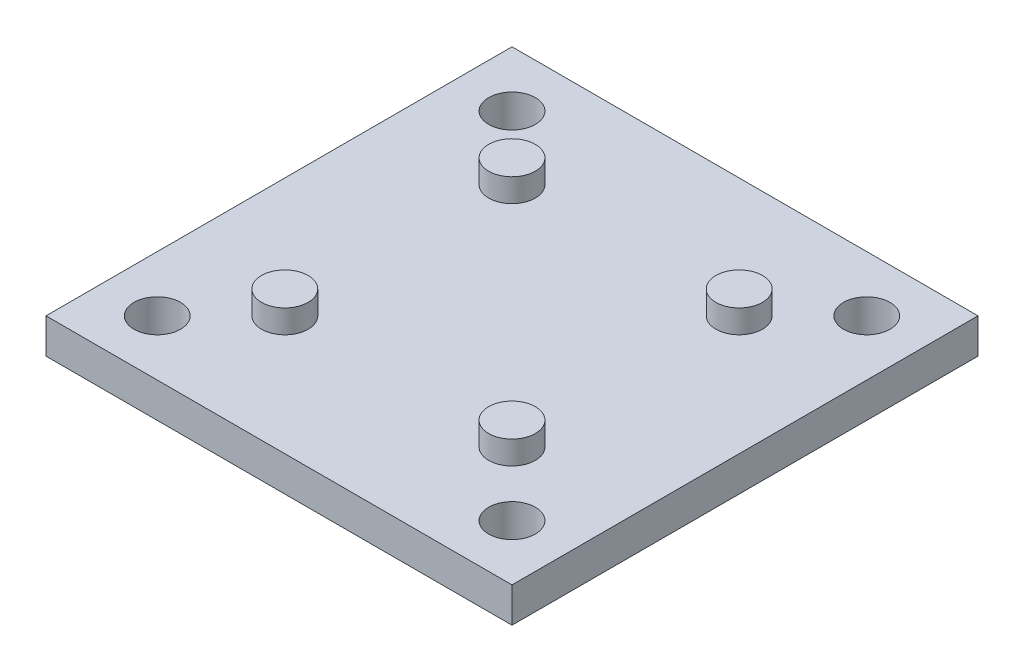
ISO-10303-21;
HEADER;
FILE_DESCRIPTION(('STEP AP214'),'2;1');
FILE_NAME('part.step','',(''),(''),'','','');
FILE_SCHEMA(('AUTOMOTIVE_DESIGN { 1 0 10303 214 1 1 1 1 }'));
ENDSEC;
DATA;
#1=APPLICATION_CONTEXT('core data for automotive mechanical design processes');
#2=APPLICATION_PROTOCOL_DEFINITION('international standard','automotive_design',2000,#1);
#3=PRODUCT_CONTEXT('',#1,'mechanical');
#4=PRODUCT('Part','Part','',(#3));
#5=PRODUCT_RELATED_PRODUCT_CATEGORY('part','',(#4));
#6=PRODUCT_DEFINITION_FORMATION('','',#4);
#7=PRODUCT_DEFINITION_CONTEXT('part definition',#1,'design');
#8=PRODUCT_DEFINITION('design','',#6,#7);
#9=PRODUCT_DEFINITION_SHAPE('','',#8);
#10=(LENGTH_UNIT() NAMED_UNIT(*) SI_UNIT(.MILLI.,.METRE.));
#11=(NAMED_UNIT(*) PLANE_ANGLE_UNIT() SI_UNIT($,.RADIAN.));
#12=(NAMED_UNIT(*) SI_UNIT($,.STERADIAN.) SOLID_ANGLE_UNIT());
#13=UNCERTAINTY_MEASURE_WITH_UNIT(LENGTH_MEASURE(1.E-05),#10,'distance_accuracy_value','');
#14=(GEOMETRIC_REPRESENTATION_CONTEXT(3) GLOBAL_UNCERTAINTY_ASSIGNED_CONTEXT((#13)) GLOBAL_UNIT_ASSIGNED_CONTEXT((#10,
#11,#12)) REPRESENTATION_CONTEXT('',''));
#15=CARTESIAN_POINT('',(0.,0.,0.));
#16=DIRECTION('',(0.,0.,1.));
#17=DIRECTION('',(1.,0.,0.));
#18=AXIS2_PLACEMENT_3D('',#15,#16,#17);
#19=CARTESIAN_POINT('',(-20.,3.,20.));
#20=DIRECTION('',(0.,0.,-1.));
#21=DIRECTION('',(-1.,0.,0.));
#22=AXIS2_PLACEMENT_3D('',#19,#20,#21);
#23=PLANE('',#22);
#24=DIRECTION('',(1.,0.,0.));
#25=VECTOR('',#24,1.);
#26=CARTESIAN_POINT('',(-20.,0.,20.));
#27=LINE('',#26,#25);
#28=CARTESIAN_POINT('',(-20.,0.,20.));
#29=VERTEX_POINT('',#28);
#30=CARTESIAN_POINT('',(20.,0.,20.));
#31=VERTEX_POINT('',#30);
#32=EDGE_CURVE('E107',#29,#31,#27,.T.);
#33=ORIENTED_EDGE('',*,*,#32,.T.);
#34=DIRECTION('',(0.,-1.,0.));
#35=VECTOR('',#34,1.);
#36=CARTESIAN_POINT('',(20.,3.,20.));
#37=LINE('',#36,#35);
#38=CARTESIAN_POINT('',(20.,3.,20.));
#39=VERTEX_POINT('',#38);
#40=EDGE_CURVE('E11',#39,#31,#37,.T.);
#41=ORIENTED_EDGE('',*,*,#40,.F.);
#42=DIRECTION('',(1.,0.,0.));
#43=VECTOR('',#42,1.);
#44=CARTESIAN_POINT('',(-20.,3.,20.));
#45=LINE('',#44,#43);
#46=CARTESIAN_POINT('',(-20.,3.,20.));
#47=VERTEX_POINT('',#46);
#48=EDGE_CURVE('E89',#47,#39,#45,.T.);
#49=ORIENTED_EDGE('',*,*,#48,.F.);
#50=DIRECTION('',(0.,-1.,0.));
#51=VECTOR('',#50,1.);
#52=CARTESIAN_POINT('',(-20.,3.,20.));
#53=LINE('',#52,#51);
#54=EDGE_CURVE('E56',#47,#29,#53,.T.);
#55=ORIENTED_EDGE('',*,*,#54,.T.);
#56=EDGE_LOOP('',(#33,#41,#49,#55));
#57=FACE_BOUND('',#56,.T.);
#58=ADVANCED_FACE('F39',(#57),#23,.F.);
#59=CARTESIAN_POINT('',(20.,3.,20.));
#60=DIRECTION('',(-1.,0.,0.));
#61=DIRECTION('',(0.,0.,1.));
#62=AXIS2_PLACEMENT_3D('',#59,#60,#61);
#63=PLANE('',#62);
#64=DIRECTION('',(0.,0.,-1.));
#65=VECTOR('',#64,1.);
#66=CARTESIAN_POINT('',(20.,0.,20.));
#67=LINE('',#66,#65);
#68=CARTESIAN_POINT('',(20.,0.,-20.));
#69=VERTEX_POINT('',#68);
#70=EDGE_CURVE('E95',#31,#69,#67,.T.);
#71=ORIENTED_EDGE('',*,*,#70,.T.);
#72=DIRECTION('',(0.,-1.,0.));
#73=VECTOR('',#72,1.);
#74=CARTESIAN_POINT('',(20.,3.,-20.));
#75=LINE('',#74,#73);
#76=CARTESIAN_POINT('',(20.,3.,-20.));
#77=VERTEX_POINT('',#76);
#78=EDGE_CURVE('E48',#77,#69,#75,.T.);
#79=ORIENTED_EDGE('',*,*,#78,.F.);
#80=DIRECTION('',(0.,0.,-1.));
#81=VECTOR('',#80,1.);
#82=CARTESIAN_POINT('',(20.,3.,20.));
#83=LINE('',#82,#81);
#84=EDGE_CURVE('E81',#39,#77,#83,.T.);
#85=ORIENTED_EDGE('',*,*,#84,.F.);
#86=ORIENTED_EDGE('',*,*,#40,.T.);
#87=EDGE_LOOP('',(#71,#79,#85,#86));
#88=FACE_BOUND('',#87,.T.);
#89=ADVANCED_FACE('F94',(#88),#63,.F.);
#90=CARTESIAN_POINT('',(-20.,3.,-20.));
#91=DIRECTION('',(0.,0.,-1.));
#92=DIRECTION('',(-1.,0.,0.));
#93=AXIS2_PLACEMENT_3D('',#90,#91,#92);
#94=PLANE('',#93);
#95=DIRECTION('',(1.,0.,0.));
#96=VECTOR('',#95,1.);
#97=CARTESIAN_POINT('',(-20.,0.,-20.));
#98=LINE('',#97,#96);
#99=CARTESIAN_POINT('',(-20.,0.,-20.));
#100=VERTEX_POINT('',#99);
#101=EDGE_CURVE('E113',#100,#69,#98,.T.);
#102=ORIENTED_EDGE('',*,*,#101,.F.);
#103=DIRECTION('',(0.,-1.,0.));
#104=VECTOR('',#103,1.);
#105=CARTESIAN_POINT('',(-20.,3.,-20.));
#106=LINE('',#105,#104);
#107=CARTESIAN_POINT('',(-20.,3.,-20.));
#108=VERTEX_POINT('',#107);
#109=EDGE_CURVE('E70',#108,#100,#106,.T.);
#110=ORIENTED_EDGE('',*,*,#109,.F.);
#111=DIRECTION('',(1.,0.,0.));
#112=VECTOR('',#111,1.);
#113=CARTESIAN_POINT('',(-20.,3.,-20.));
#114=LINE('',#113,#112);
#115=EDGE_CURVE('E88',#108,#77,#114,.T.);
#116=ORIENTED_EDGE('',*,*,#115,.T.);
#117=ORIENTED_EDGE('',*,*,#78,.T.);
#118=EDGE_LOOP('',(#102,#110,#116,#117));
#119=FACE_BOUND('',#118,.T.);
#120=ADVANCED_FACE('F99',(#119),#94,.T.);
#121=CARTESIAN_POINT('',(-20.,3.,20.));
#122=DIRECTION('',(-1.,0.,0.));
#123=DIRECTION('',(0.,0.,1.));
#124=AXIS2_PLACEMENT_3D('',#121,#122,#123);
#125=PLANE('',#124);
#126=DIRECTION('',(0.,0.,-1.));
#127=VECTOR('',#126,1.);
#128=CARTESIAN_POINT('',(-20.,0.,20.));
#129=LINE('',#128,#127);
#130=EDGE_CURVE('E116',#29,#100,#129,.T.);
#131=ORIENTED_EDGE('',*,*,#130,.F.);
#132=ORIENTED_EDGE('',*,*,#54,.F.);
#133=DIRECTION('',(0.,0.,-1.));
#134=VECTOR('',#133,1.);
#135=CARTESIAN_POINT('',(-20.,3.,20.));
#136=LINE('',#135,#134);
#137=EDGE_CURVE('E101',#47,#108,#136,.T.);
#138=ORIENTED_EDGE('',*,*,#137,.T.);
#139=ORIENTED_EDGE('',*,*,#109,.T.);
#140=EDGE_LOOP('',(#131,#132,#138,#139));
#141=FACE_BOUND('',#140,.T.);
#142=ADVANCED_FACE('F211',(#141),#125,.T.);
#143=CARTESIAN_POINT('',(0.,3.,0.));
#144=DIRECTION('',(0.,1.,0.));
#145=DIRECTION('',(0.,0.,1.));
#146=AXIS2_PLACEMENT_3D('',#143,#144,#145);
#147=PLANE('',#146);
#148=CARTESIAN_POINT('',(9.75,3.,9.75));
#149=DIRECTION('',(0.,1.,0.));
#150=DIRECTION('',(0.,0.,1.));
#151=AXIS2_PLACEMENT_3D('',#148,#149,#150);
#152=CIRCLE('',#151,2.);
#153=CARTESIAN_POINT('',(9.75,3.,11.75));
#154=VERTEX_POINT('',#153);
#155=EDGE_CURVE('E181',#154,#154,#152,.F.);
#156=ORIENTED_EDGE('',*,*,#155,.T.);
#157=EDGE_LOOP('',(#156));
#158=FACE_BOUND('',#157,.T.);
#159=CARTESIAN_POINT('',(-9.75,3.,9.75));
#160=DIRECTION('',(0.,1.,0.));
#161=DIRECTION('',(0.,0.,1.));
#162=AXIS2_PLACEMENT_3D('',#159,#160,#161);
#163=CIRCLE('',#162,2.);
#164=CARTESIAN_POINT('',(-9.75,3.,11.75));
#165=VERTEX_POINT('',#164);
#166=EDGE_CURVE('E173',#165,#165,#163,.F.);
#167=ORIENTED_EDGE('',*,*,#166,.T.);
#168=EDGE_LOOP('',(#167));
#169=FACE_BOUND('',#168,.T.);
#170=CARTESIAN_POINT('',(9.75,3.,-9.75));
#171=DIRECTION('',(0.,1.,0.));
#172=DIRECTION('',(0.,0.,1.));
#173=AXIS2_PLACEMENT_3D('',#170,#171,#172);
#174=CIRCLE('',#173,2.);
#175=CARTESIAN_POINT('',(9.75,3.,-7.75));
#176=VERTEX_POINT('',#175);
#177=EDGE_CURVE('E165',#176,#176,#174,.F.);
#178=ORIENTED_EDGE('',*,*,#177,.T.);
#179=EDGE_LOOP('',(#178));
#180=FACE_BOUND('',#179,.T.);
#181=CARTESIAN_POINT('',(-9.75,3.,-9.75));
#182=DIRECTION('',(0.,1.,0.));
#183=DIRECTION('',(0.,0.,1.));
#184=AXIS2_PLACEMENT_3D('',#181,#182,#183);
#185=CIRCLE('',#184,2.);
#186=CARTESIAN_POINT('',(-9.75,3.,-7.75));
#187=VERTEX_POINT('',#186);
#188=EDGE_CURVE('E139',#187,#187,#185,.F.);
#189=ORIENTED_EDGE('',*,*,#188,.T.);
#190=EDGE_LOOP('',(#189));
#191=FACE_BOUND('',#190,.T.);
#192=CARTESIAN_POINT('',(-15.2247989874837,3.,-15.2247989874837));
#193=DIRECTION('',(0.,1.,0.));
#194=DIRECTION('',(0.,0.,1.));
#195=AXIS2_PLACEMENT_3D('',#192,#193,#194);
#196=CIRCLE('',#195,2.);
#197=CARTESIAN_POINT('',(-15.2247989874837,3.,-13.2247989874837));
#198=VERTEX_POINT('',#197);
#199=EDGE_CURVE('E138',#198,#198,#196,.T.);
#200=ORIENTED_EDGE('',*,*,#199,.F.);
#201=EDGE_LOOP('',(#200));
#202=FACE_BOUND('',#201,.T.);
#203=CARTESIAN_POINT('',(15.2247989874837,3.,-15.2247989874837));
#204=DIRECTION('',(0.,1.,0.));
#205=DIRECTION('',(0.,0.,1.));
#206=AXIS2_PLACEMENT_3D('',#203,#204,#205);
#207=CIRCLE('',#206,2.);
#208=CARTESIAN_POINT('',(15.2247989874837,3.,-13.2247989874837));
#209=VERTEX_POINT('',#208);
#210=EDGE_CURVE('E147',#209,#209,#207,.T.);
#211=ORIENTED_EDGE('',*,*,#210,.F.);
#212=EDGE_LOOP('',(#211));
#213=FACE_BOUND('',#212,.T.);
#214=CARTESIAN_POINT('',(15.2247989874837,3.,15.2247989874837));
#215=DIRECTION('',(0.,1.,0.));
#216=DIRECTION('',(0.,0.,1.));
#217=AXIS2_PLACEMENT_3D('',#214,#215,#216);
#218=CIRCLE('',#217,2.);
#219=CARTESIAN_POINT('',(15.2247989874837,3.,17.2247989874837));
#220=VERTEX_POINT('',#219);
#221=EDGE_CURVE('E130',#220,#220,#218,.T.);
#222=ORIENTED_EDGE('',*,*,#221,.F.);
#223=EDGE_LOOP('',(#222));
#224=FACE_BOUND('',#223,.T.);
#225=CARTESIAN_POINT('',(-15.2247989874837,3.,15.2247989874837));
#226=DIRECTION('',(0.,1.,0.));
#227=DIRECTION('',(0.,0.,1.));
#228=AXIS2_PLACEMENT_3D('',#225,#226,#227);
#229=CIRCLE('',#228,2.);
#230=CARTESIAN_POINT('',(-15.2247989874837,3.,17.2247989874837));
#231=VERTEX_POINT('',#230);
#232=EDGE_CURVE('E110',#231,#231,#229,.T.);
#233=ORIENTED_EDGE('',*,*,#232,.F.);
#234=EDGE_LOOP('',(#233));
#235=FACE_BOUND('',#234,.T.);
#236=ORIENTED_EDGE('',*,*,#48,.T.);
#237=ORIENTED_EDGE('',*,*,#84,.T.);
#238=ORIENTED_EDGE('',*,*,#115,.F.);
#239=ORIENTED_EDGE('',*,*,#137,.F.);
#240=EDGE_LOOP('',(#236,#237,#238,#239));
#241=FACE_BOUND('',#240,.T.);
#242=ADVANCED_FACE('F85',(#158,#169,#180,#191,#202,#213,#224,#235,#241),#147,.T.);
#243=CARTESIAN_POINT('',(0.,0.,0.));
#244=DIRECTION('',(0.,1.,0.));
#245=DIRECTION('',(0.,0.,1.));
#246=AXIS2_PLACEMENT_3D('',#243,#244,#245);
#247=PLANE('',#246);
#248=CARTESIAN_POINT('',(-15.2247989874837,0.,-15.2247989874837));
#249=DIRECTION('',(0.,1.,0.));
#250=DIRECTION('',(0.,0.,1.));
#251=AXIS2_PLACEMENT_3D('',#248,#249,#250);
#252=CIRCLE('',#251,2.);
#253=CARTESIAN_POINT('',(-15.2247989874837,0.,-13.2247989874837));
#254=VERTEX_POINT('',#253);
#255=EDGE_CURVE('E134',#254,#254,#252,.T.);
#256=ORIENTED_EDGE('',*,*,#255,.T.);
#257=EDGE_LOOP('',(#256));
#258=FACE_BOUND('',#257,.T.);
#259=CARTESIAN_POINT('',(15.2247989874837,0.,-15.2247989874837));
#260=DIRECTION('',(0.,1.,0.));
#261=DIRECTION('',(0.,0.,1.));
#262=AXIS2_PLACEMENT_3D('',#259,#260,#261);
#263=CIRCLE('',#262,2.);
#264=CARTESIAN_POINT('',(15.2247989874837,0.,-13.2247989874837));
#265=VERTEX_POINT('',#264);
#266=EDGE_CURVE('E143',#265,#265,#263,.T.);
#267=ORIENTED_EDGE('',*,*,#266,.T.);
#268=EDGE_LOOP('',(#267));
#269=FACE_BOUND('',#268,.T.);
#270=CARTESIAN_POINT('',(15.2247989874837,0.,15.2247989874837));
#271=DIRECTION('',(0.,1.,0.));
#272=DIRECTION('',(0.,0.,1.));
#273=AXIS2_PLACEMENT_3D('',#270,#271,#272);
#274=CIRCLE('',#273,2.);
#275=CARTESIAN_POINT('',(15.2247989874837,0.,17.2247989874837));
#276=VERTEX_POINT('',#275);
#277=EDGE_CURVE('E151',#276,#276,#274,.T.);
#278=ORIENTED_EDGE('',*,*,#277,.T.);
#279=EDGE_LOOP('',(#278));
#280=FACE_BOUND('',#279,.T.);
#281=CARTESIAN_POINT('',(-15.2247989874837,0.,15.2247989874837));
#282=DIRECTION('',(0.,1.,0.));
#283=DIRECTION('',(0.,0.,1.));
#284=AXIS2_PLACEMENT_3D('',#281,#282,#283);
#285=CIRCLE('',#284,2.);
#286=CARTESIAN_POINT('',(-15.2247989874837,0.,17.2247989874837));
#287=VERTEX_POINT('',#286);
#288=EDGE_CURVE('E126',#287,#287,#285,.T.);
#289=ORIENTED_EDGE('',*,*,#288,.T.);
#290=EDGE_LOOP('',(#289));
#291=FACE_BOUND('',#290,.T.);
#292=ORIENTED_EDGE('',*,*,#32,.F.);
#293=ORIENTED_EDGE('',*,*,#130,.T.);
#294=ORIENTED_EDGE('',*,*,#101,.T.);
#295=ORIENTED_EDGE('',*,*,#70,.F.);
#296=EDGE_LOOP('',(#292,#293,#294,#295));
#297=FACE_BOUND('',#296,.T.);
#298=ADVANCED_FACE('F210',(#258,#269,#280,#291,#297),#247,.F.);
#299=CARTESIAN_POINT('',(-15.2247989874837,3.,15.2247989874837));
#300=DIRECTION('',(0.,-1.,0.));
#301=DIRECTION('',(0.,0.,-1.));
#302=AXIS2_PLACEMENT_3D('',#299,#300,#301);
#303=CYLINDRICAL_SURFACE('',#302,2.);
#304=ORIENTED_EDGE('',*,*,#232,.T.);
#305=EDGE_LOOP('',(#304));
#306=FACE_BOUND('',#305,.T.);
#307=ORIENTED_EDGE('',*,*,#288,.F.);
#308=EDGE_LOOP('',(#307));
#309=FACE_BOUND('',#308,.T.);
#310=ADVANCED_FACE('F223',(#306,#309),#303,.F.);
#311=CARTESIAN_POINT('',(15.2247989874837,3.,15.2247989874837));
#312=DIRECTION('',(0.,-1.,0.));
#313=DIRECTION('',(0.,0.,-1.));
#314=AXIS2_PLACEMENT_3D('',#311,#312,#313);
#315=CYLINDRICAL_SURFACE('',#314,2.);
#316=ORIENTED_EDGE('',*,*,#221,.T.);
#317=EDGE_LOOP('',(#316));
#318=FACE_BOUND('',#317,.T.);
#319=ORIENTED_EDGE('',*,*,#277,.F.);
#320=EDGE_LOOP('',(#319));
#321=FACE_BOUND('',#320,.T.);
#322=ADVANCED_FACE('F228',(#318,#321),#315,.F.);
#323=CARTESIAN_POINT('',(15.2247989874837,3.,-15.2247989874837));
#324=DIRECTION('',(0.,-1.,0.));
#325=DIRECTION('',(0.,0.,-1.));
#326=AXIS2_PLACEMENT_3D('',#323,#324,#325);
#327=CYLINDRICAL_SURFACE('',#326,2.);
#328=ORIENTED_EDGE('',*,*,#210,.T.);
#329=EDGE_LOOP('',(#328));
#330=FACE_BOUND('',#329,.T.);
#331=ORIENTED_EDGE('',*,*,#266,.F.);
#332=EDGE_LOOP('',(#331));
#333=FACE_BOUND('',#332,.T.);
#334=ADVANCED_FACE('F234',(#330,#333),#327,.F.);
#335=CARTESIAN_POINT('',(-15.2247989874837,3.,-15.2247989874837));
#336=DIRECTION('',(0.,-1.,0.));
#337=DIRECTION('',(0.,0.,-1.));
#338=AXIS2_PLACEMENT_3D('',#335,#336,#337);
#339=CYLINDRICAL_SURFACE('',#338,2.);
#340=ORIENTED_EDGE('',*,*,#199,.T.);
#341=EDGE_LOOP('',(#340));
#342=FACE_BOUND('',#341,.T.);
#343=ORIENTED_EDGE('',*,*,#255,.F.);
#344=EDGE_LOOP('',(#343));
#345=FACE_BOUND('',#344,.T.);
#346=ADVANCED_FACE('F230',(#342,#345),#339,.F.);
#347=CARTESIAN_POINT('',(-9.75,5.,-9.75));
#348=DIRECTION('',(0.,-1.,0.));
#349=DIRECTION('',(0.,0.,-1.));
#350=AXIS2_PLACEMENT_3D('',#347,#348,#349);
#351=CYLINDRICAL_SURFACE('',#350,2.);
#352=ORIENTED_EDGE('',*,*,#188,.F.);
#353=EDGE_LOOP('',(#352));
#354=FACE_BOUND('',#353,.T.);
#355=CARTESIAN_POINT('',(-9.75,5.,-9.75));
#356=DIRECTION('',(0.,1.,0.));
#357=DIRECTION('',(0.,0.,1.));
#358=AXIS2_PLACEMENT_3D('',#355,#356,#357);
#359=CIRCLE('',#358,2.);
#360=CARTESIAN_POINT('',(-9.75,5.,-7.75));
#361=VERTEX_POINT('',#360);
#362=EDGE_CURVE('E161',#361,#361,#359,.T.);
#363=ORIENTED_EDGE('',*,*,#362,.F.);
#364=EDGE_LOOP('',(#363));
#365=FACE_BOUND('',#364,.T.);
#366=ADVANCED_FACE('F233',(#354,#365),#351,.T.);
#367=CARTESIAN_POINT('',(-9.75,5.,-9.75));
#368=DIRECTION('',(0.,1.,0.));
#369=DIRECTION('',(0.,0.,1.));
#370=AXIS2_PLACEMENT_3D('',#367,#368,#369);
#371=PLANE('',#370);
#372=ORIENTED_EDGE('',*,*,#362,.T.);
#373=EDGE_LOOP('',(#372));
#374=FACE_BOUND('',#373,.T.);
#375=ADVANCED_FACE('F244',(#374),#371,.T.);
#376=CARTESIAN_POINT('',(9.75,5.,-9.75));
#377=DIRECTION('',(0.,-1.,0.));
#378=DIRECTION('',(0.,0.,-1.));
#379=AXIS2_PLACEMENT_3D('',#376,#377,#378);
#380=CYLINDRICAL_SURFACE('',#379,2.);
#381=ORIENTED_EDGE('',*,*,#177,.F.);
#382=EDGE_LOOP('',(#381));
#383=FACE_BOUND('',#382,.T.);
#384=CARTESIAN_POINT('',(9.75,5.,-9.75));
#385=DIRECTION('',(0.,1.,0.));
#386=DIRECTION('',(0.,0.,1.));
#387=AXIS2_PLACEMENT_3D('',#384,#385,#386);
#388=CIRCLE('',#387,2.);
#389=CARTESIAN_POINT('',(9.75,5.,-7.75));
#390=VERTEX_POINT('',#389);
#391=EDGE_CURVE('E169',#390,#390,#388,.T.);
#392=ORIENTED_EDGE('',*,*,#391,.F.);
#393=EDGE_LOOP('',(#392));
#394=FACE_BOUND('',#393,.T.);
#395=ADVANCED_FACE('F248',(#383,#394),#380,.T.);
#396=CARTESIAN_POINT('',(9.75,5.,-9.75));
#397=DIRECTION('',(0.,1.,0.));
#398=DIRECTION('',(0.,0.,1.));
#399=AXIS2_PLACEMENT_3D('',#396,#397,#398);
#400=PLANE('',#399);
#401=ORIENTED_EDGE('',*,*,#391,.T.);
#402=EDGE_LOOP('',(#401));
#403=FACE_BOUND('',#402,.T.);
#404=ADVANCED_FACE('F250',(#403),#400,.T.);
#405=CARTESIAN_POINT('',(-9.75,5.,9.75));
#406=DIRECTION('',(0.,-1.,0.));
#407=DIRECTION('',(0.,0.,-1.));
#408=AXIS2_PLACEMENT_3D('',#405,#406,#407);
#409=CYLINDRICAL_SURFACE('',#408,2.);
#410=ORIENTED_EDGE('',*,*,#166,.F.);
#411=EDGE_LOOP('',(#410));
#412=FACE_BOUND('',#411,.T.);
#413=CARTESIAN_POINT('',(-9.75,5.,9.75));
#414=DIRECTION('',(0.,1.,0.));
#415=DIRECTION('',(0.,0.,1.));
#416=AXIS2_PLACEMENT_3D('',#413,#414,#415);
#417=CIRCLE('',#416,2.);
#418=CARTESIAN_POINT('',(-9.75,5.,11.75));
#419=VERTEX_POINT('',#418);
#420=EDGE_CURVE('E177',#419,#419,#417,.T.);
#421=ORIENTED_EDGE('',*,*,#420,.F.);
#422=EDGE_LOOP('',(#421));
#423=FACE_BOUND('',#422,.T.);
#424=ADVANCED_FACE('F202',(#412,#423),#409,.T.);
#425=CARTESIAN_POINT('',(-9.75,5.,9.75));
#426=DIRECTION('',(0.,1.,0.));
#427=DIRECTION('',(0.,0.,1.));
#428=AXIS2_PLACEMENT_3D('',#425,#426,#427);
#429=PLANE('',#428);
#430=ORIENTED_EDGE('',*,*,#420,.T.);
#431=EDGE_LOOP('',(#430));
#432=FACE_BOUND('',#431,.T.);
#433=ADVANCED_FACE('F194',(#432),#429,.T.);
#434=CARTESIAN_POINT('',(9.75,5.,9.75));
#435=DIRECTION('',(0.,-1.,0.));
#436=DIRECTION('',(0.,0.,-1.));
#437=AXIS2_PLACEMENT_3D('',#434,#435,#436);
#438=CYLINDRICAL_SURFACE('',#437,2.);
#439=ORIENTED_EDGE('',*,*,#155,.F.);
#440=EDGE_LOOP('',(#439));
#441=FACE_BOUND('',#440,.T.);
#442=CARTESIAN_POINT('',(9.75,5.,9.75));
#443=DIRECTION('',(0.,1.,0.));
#444=DIRECTION('',(0.,0.,1.));
#445=AXIS2_PLACEMENT_3D('',#442,#443,#444);
#446=CIRCLE('',#445,2.);
#447=CARTESIAN_POINT('',(9.75,5.,11.75));
#448=VERTEX_POINT('',#447);
#449=EDGE_CURVE('E185',#448,#448,#446,.T.);
#450=ORIENTED_EDGE('',*,*,#449,.F.);
#451=EDGE_LOOP('',(#450));
#452=FACE_BOUND('',#451,.T.);
#453=ADVANCED_FACE('F192',(#441,#452),#438,.T.);
#454=CARTESIAN_POINT('',(9.75,5.,9.75));
#455=DIRECTION('',(0.,1.,0.));
#456=DIRECTION('',(0.,0.,1.));
#457=AXIS2_PLACEMENT_3D('',#454,#455,#456);
#458=PLANE('',#457);
#459=ORIENTED_EDGE('',*,*,#449,.T.);
#460=EDGE_LOOP('',(#459));
#461=FACE_BOUND('',#460,.T.);
#462=ADVANCED_FACE('F190',(#461),#458,.T.);
#463=CLOSED_SHELL('',(#58,#89,#120,#142,#242,#298,#310,#322,#334,#346,#366,#375,#395,#404,#424,
#433,#453,#462));
#464=MANIFOLD_SOLID_BREP('B2',#463);
#465=ADVANCED_BREP_SHAPE_REPRESENTATION('',(#18,#464),#14);
#466=SHAPE_DEFINITION_REPRESENTATION(#9,#465);
ENDSEC;
END-ISO-10303-21;
